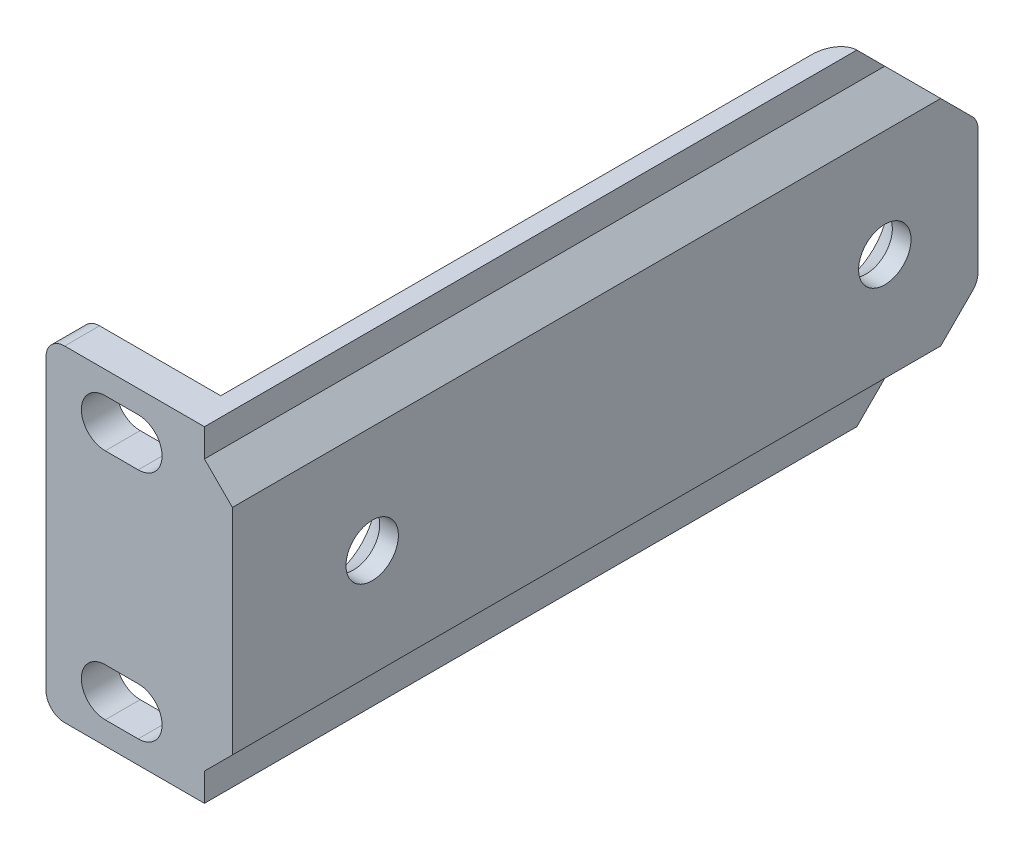
ISO-10303-21;
HEADER;
FILE_DESCRIPTION(('STEP AP214'),'2;1');
FILE_NAME('part.step','',(''),(''),'','','');
FILE_SCHEMA(('AUTOMOTIVE_DESIGN { 1 0 10303 214 1 1 1 1 }'));
ENDSEC;
DATA;
#1=APPLICATION_CONTEXT('core data for automotive mechanical design processes');
#2=APPLICATION_PROTOCOL_DEFINITION('international standard','automotive_design',2000,#1);
#3=PRODUCT_CONTEXT('',#1,'mechanical');
#4=PRODUCT('Part','Part','',(#3));
#5=PRODUCT_RELATED_PRODUCT_CATEGORY('part','',(#4));
#6=PRODUCT_DEFINITION_FORMATION('','',#4);
#7=PRODUCT_DEFINITION_CONTEXT('part definition',#1,'design');
#8=PRODUCT_DEFINITION('design','',#6,#7);
#9=PRODUCT_DEFINITION_SHAPE('','',#8);
#10=(LENGTH_UNIT() NAMED_UNIT(*) SI_UNIT(.MILLI.,.METRE.));
#11=(NAMED_UNIT(*) PLANE_ANGLE_UNIT() SI_UNIT($,.RADIAN.));
#12=(NAMED_UNIT(*) SI_UNIT($,.STERADIAN.) SOLID_ANGLE_UNIT());
#13=UNCERTAINTY_MEASURE_WITH_UNIT(LENGTH_MEASURE(1.E-05),#10,'distance_accuracy_value','');
#14=(GEOMETRIC_REPRESENTATION_CONTEXT(3) GLOBAL_UNCERTAINTY_ASSIGNED_CONTEXT((#13)) GLOBAL_UNIT_ASSIGNED_CONTEXT((#10,
#11,#12)) REPRESENTATION_CONTEXT('',''));
#15=CARTESIAN_POINT('',(0.,0.,0.));
#16=DIRECTION('',(0.,0.,1.));
#17=DIRECTION('',(1.,0.,0.));
#18=AXIS2_PLACEMENT_3D('',#15,#16,#17);
#19=CARTESIAN_POINT('',(-25.4,22.225,0.));
#20=DIRECTION('',(0.,0.,-1.));
#21=DIRECTION('',(-1.,0.,0.));
#22=AXIS2_PLACEMENT_3D('',#19,#20,#21);
#23=PLANE('',#22);
#24=DIRECTION('',(-1.,0.,0.));
#25=VECTOR('',#24,1.);
#26=CARTESIAN_POINT('',(-12.83335,-12.6238,0.));
#27=LINE('',#26,#25);
#28=CARTESIAN_POINT('',(-12.83335,-12.6238,0.));
#29=VERTEX_POINT('',#28);
#30=CARTESIAN_POINT('',(-17.32915,-12.6238,0.));
#31=VERTEX_POINT('',#30);
#32=EDGE_CURVE('E403',#29,#31,#27,.T.);
#33=ORIENTED_EDGE('',*,*,#32,.F.);
#34=CARTESIAN_POINT('',(-12.83335,-15.875,0.));
#35=DIRECTION('',(0.,0.,1.));
#36=DIRECTION('',(1.,0.,0.));
#37=AXIS2_PLACEMENT_3D('',#34,#35,#36);
#38=CIRCLE('',#37,3.25119999999999);
#39=CARTESIAN_POINT('',(-12.83335,-19.1262,0.));
#40=VERTEX_POINT('',#39);
#41=EDGE_CURVE('E377',#40,#29,#38,.T.);
#42=ORIENTED_EDGE('',*,*,#41,.F.);
#43=DIRECTION('',(1.,0.,0.));
#44=VECTOR('',#43,1.);
#45=CARTESIAN_POINT('',(-12.83335,-19.1262,0.));
#46=LINE('',#45,#44);
#47=CARTESIAN_POINT('',(-17.32915,-19.1262,0.));
#48=VERTEX_POINT('',#47);
#49=EDGE_CURVE('E393',#48,#40,#46,.T.);
#50=ORIENTED_EDGE('',*,*,#49,.F.);
#51=CARTESIAN_POINT('',(-17.32915,-15.875,0.));
#52=DIRECTION('',(0.,0.,1.));
#53=DIRECTION('',(1.,0.,0.));
#54=AXIS2_PLACEMENT_3D('',#51,#52,#53);
#55=CIRCLE('',#54,3.2512);
#56=EDGE_CURVE('E400',#31,#48,#55,.T.);
#57=ORIENTED_EDGE('',*,*,#56,.F.);
#58=EDGE_LOOP('',(#33,#42,#50,#57));
#59=FACE_BOUND('',#58,.T.);
#60=DIRECTION('',(-1.,0.,0.));
#61=VECTOR('',#60,1.);
#62=CARTESIAN_POINT('',(-12.83335,19.1262,0.));
#63=LINE('',#62,#61);
#64=CARTESIAN_POINT('',(-12.83335,19.1262,0.));
#65=VERTEX_POINT('',#64);
#66=CARTESIAN_POINT('',(-17.32915,19.1262,0.));
#67=VERTEX_POINT('',#66);
#68=EDGE_CURVE('E383',#65,#67,#63,.T.);
#69=ORIENTED_EDGE('',*,*,#68,.F.);
#70=CARTESIAN_POINT('',(-12.83335,15.875,0.));
#71=DIRECTION('',(0.,0.,1.));
#72=DIRECTION('',(-1.,0.,0.));
#73=AXIS2_PLACEMENT_3D('',#70,#71,#72);
#74=CIRCLE('',#73,3.25119999999999);
#75=CARTESIAN_POINT('',(-12.83335,12.6238,0.));
#76=VERTEX_POINT('',#75);
#77=EDGE_CURVE('E386',#76,#65,#74,.T.);
#78=ORIENTED_EDGE('',*,*,#77,.F.);
#79=DIRECTION('',(1.,0.,0.));
#80=VECTOR('',#79,1.);
#81=CARTESIAN_POINT('',(-12.83335,12.6238,0.));
#82=LINE('',#81,#80);
#83=CARTESIAN_POINT('',(-17.32915,12.6238,0.));
#84=VERTEX_POINT('',#83);
#85=EDGE_CURVE('E371',#84,#76,#82,.T.);
#86=ORIENTED_EDGE('',*,*,#85,.F.);
#87=CARTESIAN_POINT('',(-17.32915,15.875,0.));
#88=DIRECTION('',(0.,0.,1.));
#89=DIRECTION('',(-1.,0.,0.));
#90=AXIS2_PLACEMENT_3D('',#87,#88,#89);
#91=CIRCLE('',#90,3.2512);
#92=EDGE_CURVE('E380',#67,#84,#91,.T.);
#93=ORIENTED_EDGE('',*,*,#92,.F.);
#94=EDGE_LOOP('',(#69,#78,#86,#93));
#95=FACE_BOUND('',#94,.T.);
#96=DIRECTION('',(0.,-1.,0.));
#97=VECTOR('',#96,1.);
#98=CARTESIAN_POINT('',(0.,22.225,0.));
#99=LINE('',#98,#97);
#100=CARTESIAN_POINT('',(0.,14.605,0.));
#101=VERTEX_POINT('',#100);
#102=CARTESIAN_POINT('',(0.,-14.605,0.));
#103=VERTEX_POINT('',#102);
#104=EDGE_CURVE('E327',#101,#103,#99,.T.);
#105=ORIENTED_EDGE('',*,*,#104,.F.);
#106=DIRECTION('',(0.707106781186549,-0.707106781186546,0.));
#107=VECTOR('',#106,1.);
#108=CARTESIAN_POINT('',(0.,14.605,0.));
#109=LINE('',#108,#107);
#110=CARTESIAN_POINT('',(-3.81,18.415,0.));
#111=VERTEX_POINT('',#110);
#112=EDGE_CURVE('E237',#101,#111,#109,.F.);
#113=ORIENTED_EDGE('',*,*,#112,.T.);
#114=DIRECTION('',(0.,-1.,0.));
#115=VECTOR('',#114,1.);
#116=CARTESIAN_POINT('',(-3.81,22.225,0.));
#117=LINE('',#116,#115);
#118=CARTESIAN_POINT('',(-3.81,22.225,0.));
#119=VERTEX_POINT('',#118);
#120=EDGE_CURVE('E222',#119,#111,#117,.T.);
#121=ORIENTED_EDGE('',*,*,#120,.F.);
#122=DIRECTION('',(1.,0.,0.));
#123=VECTOR('',#122,1.);
#124=CARTESIAN_POINT('',(-25.4,22.225,0.));
#125=LINE('',#124,#123);
#126=CARTESIAN_POINT('',(-22.86,22.225,0.));
#127=VERTEX_POINT('',#126);
#128=EDGE_CURVE('E345',#127,#119,#125,.T.);
#129=ORIENTED_EDGE('',*,*,#128,.F.);
#130=CARTESIAN_POINT('',(-22.86,19.685,0.));
#131=DIRECTION('',(0.,0.,-1.));
#132=DIRECTION('',(-1.,0.,0.));
#133=AXIS2_PLACEMENT_3D('',#130,#131,#132);
#134=CIRCLE('',#133,2.54);
#135=CARTESIAN_POINT('',(-25.4,19.685,0.));
#136=VERTEX_POINT('',#135);
#137=EDGE_CURVE('E296',#127,#136,#134,.F.);
#138=ORIENTED_EDGE('',*,*,#137,.T.);
#139=DIRECTION('',(0.,-1.,0.));
#140=VECTOR('',#139,1.);
#141=CARTESIAN_POINT('',(-25.4,22.225,0.));
#142=LINE('',#141,#140);
#143=CARTESIAN_POINT('',(-25.4,-19.685,0.));
#144=VERTEX_POINT('',#143);
#145=EDGE_CURVE('E338',#136,#144,#142,.T.);
#146=ORIENTED_EDGE('',*,*,#145,.T.);
#147=CARTESIAN_POINT('',(-22.86,-19.685,0.));
#148=DIRECTION('',(0.,0.,-1.));
#149=DIRECTION('',(-1.,0.,0.));
#150=AXIS2_PLACEMENT_3D('',#147,#148,#149);
#151=CIRCLE('',#150,2.54);
#152=CARTESIAN_POINT('',(-22.86,-22.225,0.));
#153=VERTEX_POINT('',#152);
#154=EDGE_CURVE('E298',#144,#153,#151,.F.);
#155=ORIENTED_EDGE('',*,*,#154,.T.);
#156=DIRECTION('',(1.,0.,0.));
#157=VECTOR('',#156,1.);
#158=CARTESIAN_POINT('',(-25.4,-22.225,0.));
#159=LINE('',#158,#157);
#160=CARTESIAN_POINT('',(-3.80999999999999,-22.225,0.));
#161=VERTEX_POINT('',#160);
#162=EDGE_CURVE('E224',#153,#161,#159,.T.);
#163=ORIENTED_EDGE('',*,*,#162,.T.);
#164=DIRECTION('',(0.,-1.,0.));
#165=VECTOR('',#164,1.);
#166=CARTESIAN_POINT('',(-3.80999999999999,-22.225,0.));
#167=LINE('',#166,#165);
#168=CARTESIAN_POINT('',(-3.80999999999999,-18.415,0.));
#169=VERTEX_POINT('',#168);
#170=EDGE_CURVE('E360',#169,#161,#167,.T.);
#171=ORIENTED_EDGE('',*,*,#170,.F.);
#172=DIRECTION('',(-0.707106781186546,-0.707106781186549,0.));
#173=VECTOR('',#172,1.);
#174=CARTESIAN_POINT('',(-3.81000000000001,-18.415,0.));
#175=LINE('',#174,#173);
#176=EDGE_CURVE('E57',#169,#103,#175,.F.);
#177=ORIENTED_EDGE('',*,*,#176,.T.);
#178=EDGE_LOOP('',(#105,#113,#121,#129,#138,#146,#155,#163,#171,#177));
#179=FACE_BOUND('',#178,.T.);
#180=ADVANCED_FACE('F34',(#59,#95,#179),#23,.F.);
#181=CARTESIAN_POINT('',(0.,22.225,0.));
#182=DIRECTION('',(-1.,0.,0.));
#183=DIRECTION('',(0.,0.,1.));
#184=AXIS2_PLACEMENT_3D('',#181,#182,#183);
#185=PLANE('',#184);
#186=CARTESIAN_POINT('',(0.,0.,-19.05));
#187=DIRECTION('',(-1.,0.,0.));
#188=DIRECTION('',(0.,0.,1.));
#189=AXIS2_PLACEMENT_3D('',#186,#187,#188);
#190=CIRCLE('',#189,3.57124);
#191=CARTESIAN_POINT('',(0.,0.,-15.47876));
#192=VERTEX_POINT('',#191);
#193=EDGE_CURVE('E415',#192,#192,#190,.T.);
#194=ORIENTED_EDGE('',*,*,#193,.T.);
#195=EDGE_LOOP('',(#194));
#196=FACE_BOUND('',#195,.T.);
#197=CARTESIAN_POINT('',(0.,0.,-88.9));
#198=DIRECTION('',(-1.,0.,0.));
#199=DIRECTION('',(0.,0.,1.));
#200=AXIS2_PLACEMENT_3D('',#197,#198,#199);
#201=CIRCLE('',#200,3.57124);
#202=CARTESIAN_POINT('',(0.,0.,-85.32876));
#203=VERTEX_POINT('',#202);
#204=EDGE_CURVE('E388',#203,#203,#201,.T.);
#205=ORIENTED_EDGE('',*,*,#204,.T.);
#206=EDGE_LOOP('',(#205));
#207=FACE_BOUND('',#206,.T.);
#208=DIRECTION('',(0.,0.707106781186547,0.707106781186547));
#209=VECTOR('',#208,1.);
#210=CARTESIAN_POINT('',(0.,9.525,-101.6));
#211=LINE('',#210,#209);
#212=CARTESIAN_POINT('',(0.,10.2689487757862,-100.856051224214));
#213=VERTEX_POINT('',#212);
#214=CARTESIAN_POINT('',(0.,14.605,-96.52));
#215=VERTEX_POINT('',#214);
#216=EDGE_CURVE('E247',#213,#215,#211,.T.);
#217=ORIENTED_EDGE('',*,*,#216,.T.);
#218=DIRECTION('',(0.,0.,1.));
#219=VECTOR('',#218,1.);
#220=CARTESIAN_POINT('',(0.,14.605,0.));
#221=LINE('',#220,#219);
#222=EDGE_CURVE('E236',#215,#101,#221,.T.);
#223=ORIENTED_EDGE('',*,*,#222,.T.);
#224=ORIENTED_EDGE('',*,*,#104,.T.);
#225=DIRECTION('',(0.,0.,-1.));
#226=VECTOR('',#225,1.);
#227=CARTESIAN_POINT('',(0.,-14.605,0.));
#228=LINE('',#227,#226);
#229=CARTESIAN_POINT('',(0.,-14.605,-96.52));
#230=VERTEX_POINT('',#229);
#231=EDGE_CURVE('E49',#103,#230,#228,.T.);
#232=ORIENTED_EDGE('',*,*,#231,.T.);
#233=DIRECTION('',(0.,0.707106781186547,-0.707106781186547));
#234=VECTOR('',#233,1.);
#235=CARTESIAN_POINT('',(0.,-9.525,-101.6));
#236=LINE('',#235,#234);
#237=CARTESIAN_POINT('',(0.,-10.2689487757862,-100.856051224214));
#238=VERTEX_POINT('',#237);
#239=EDGE_CURVE('E427',#230,#238,#236,.T.);
#240=ORIENTED_EDGE('',*,*,#239,.T.);
#241=CARTESIAN_POINT('',(0.,-8.47289755157233,-99.06));
#242=DIRECTION('',(-1.,0.,0.));
#243=DIRECTION('',(0.,0.,1.));
#244=AXIS2_PLACEMENT_3D('',#241,#242,#243);
#245=CIRCLE('',#244,2.54);
#246=CARTESIAN_POINT('',(0.,-8.47289755157233,-101.6));
#247=VERTEX_POINT('',#246);
#248=EDGE_CURVE('E264',#238,#247,#245,.F.);
#249=ORIENTED_EDGE('',*,*,#248,.T.);
#250=DIRECTION('',(0.,-1.,0.));
#251=VECTOR('',#250,1.);
#252=CARTESIAN_POINT('',(0.,22.225,-101.6));
#253=LINE('',#252,#251);
#254=CARTESIAN_POINT('',(0.,8.47289755157233,-101.6));
#255=VERTEX_POINT('',#254);
#256=EDGE_CURVE('E329',#255,#247,#253,.T.);
#257=ORIENTED_EDGE('',*,*,#256,.F.);
#258=CARTESIAN_POINT('',(0.,8.47289755157233,-99.06));
#259=DIRECTION('',(-1.,0.,0.));
#260=DIRECTION('',(0.,0.,1.));
#261=AXIS2_PLACEMENT_3D('',#258,#259,#260);
#262=CIRCLE('',#261,2.54);
#263=EDGE_CURVE('E243',#255,#213,#262,.F.);
#264=ORIENTED_EDGE('',*,*,#263,.T.);
#265=EDGE_LOOP('',(#217,#223,#224,#232,#240,#249,#257,#264));
#266=FACE_BOUND('',#265,.T.);
#267=ADVANCED_FACE('F429',(#196,#207,#266),#185,.F.);
#268=CARTESIAN_POINT('',(0.,22.225,-101.6));
#269=DIRECTION('',(0.,0.,1.));
#270=DIRECTION('',(1.,0.,0.));
#271=AXIS2_PLACEMENT_3D('',#268,#269,#270);
#272=PLANE('',#271);
#273=DIRECTION('',(0.,-1.,0.));
#274=VECTOR('',#273,1.);
#275=CARTESIAN_POINT('',(-3.81,22.225,-101.6));
#276=LINE('',#275,#274);
#277=CARTESIAN_POINT('',(-3.81,-8.47289755157233,-101.6));
#278=VERTEX_POINT('',#277);
#279=CARTESIAN_POINT('',(-3.81,8.47289755157233,-101.6));
#280=VERTEX_POINT('',#279);
#281=EDGE_CURVE('E270',#278,#280,#276,.F.);
#282=ORIENTED_EDGE('',*,*,#281,.T.);
#283=DIRECTION('',(-1.,0.,0.));
#284=VECTOR('',#283,1.);
#285=CARTESIAN_POINT('',(0.,8.47289755157233,-101.6));
#286=LINE('',#285,#284);
#287=EDGE_CURVE('E268',#280,#255,#286,.F.);
#288=ORIENTED_EDGE('',*,*,#287,.T.);
#289=ORIENTED_EDGE('',*,*,#256,.T.);
#290=DIRECTION('',(-1.,0.,0.));
#291=VECTOR('',#290,1.);
#292=CARTESIAN_POINT('',(0.,-8.47289755157233,-101.6));
#293=LINE('',#292,#291);
#294=EDGE_CURVE('E272',#247,#278,#293,.T.);
#295=ORIENTED_EDGE('',*,*,#294,.T.);
#296=EDGE_LOOP('',(#282,#288,#289,#295));
#297=FACE_BOUND('',#296,.T.);
#298=ADVANCED_FACE('F443',(#297),#272,.F.);
#299=CARTESIAN_POINT('',(-6.35,22.225,-101.6));
#300=DIRECTION('',(1.,0.,0.));
#301=DIRECTION('',(0.,0.,-1.));
#302=AXIS2_PLACEMENT_3D('',#299,#300,#301);
#303=PLANE('',#302);
#304=CARTESIAN_POINT('',(-6.34999999999999,0.,-19.05));
#305=DIRECTION('',(-1.,0.,0.));
#306=DIRECTION('',(0.,0.,1.));
#307=AXIS2_PLACEMENT_3D('',#304,#305,#306);
#308=CIRCLE('',#307,6.8804917);
#309=CARTESIAN_POINT('',(-6.34999999999999,0.,-12.1695083));
#310=VERTEX_POINT('',#309);
#311=EDGE_CURVE('E421',#310,#310,#308,.T.);
#312=ORIENTED_EDGE('',*,*,#311,.F.);
#313=EDGE_LOOP('',(#312));
#314=FACE_BOUND('',#313,.T.);
#315=CARTESIAN_POINT('',(-6.34999999999999,0.,-88.9));
#316=DIRECTION('',(-1.,0.,0.));
#317=DIRECTION('',(0.,0.,1.));
#318=AXIS2_PLACEMENT_3D('',#315,#316,#317);
#319=CIRCLE('',#318,6.8804917);
#320=CARTESIAN_POINT('',(-6.34999999999999,0.,-82.0195083));
#321=VERTEX_POINT('',#320);
#322=EDGE_CURVE('E412',#321,#321,#319,.T.);
#323=ORIENTED_EDGE('',*,*,#322,.F.);
#324=EDGE_LOOP('',(#323));
#325=FACE_BOUND('',#324,.T.);
#326=DIRECTION('',(0.,-1.,0.));
#327=VECTOR('',#326,1.);
#328=CARTESIAN_POINT('',(-6.35,22.225,-99.06));
#329=LINE('',#328,#327);
#330=CARTESIAN_POINT('',(-6.35,8.47289755157233,-99.06));
#331=VERTEX_POINT('',#330);
#332=CARTESIAN_POINT('',(-6.35,-8.47289755157233,-99.06));
#333=VERTEX_POINT('',#332);
#334=EDGE_CURVE('E278',#331,#333,#329,.T.);
#335=ORIENTED_EDGE('',*,*,#334,.T.);
#336=DIRECTION('',(0.,0.707106781186548,-0.707106781186548));
#337=VECTOR('',#336,1.);
#338=CARTESIAN_POINT('',(-6.35,8.14605122421383,-115.678948775786));
#339=LINE('',#338,#337);
#340=CARTESIAN_POINT('',(-6.35,-22.225,-85.3078975515723));
#341=VERTEX_POINT('',#340);
#342=EDGE_CURVE('E276',#333,#341,#339,.F.);
#343=ORIENTED_EDGE('',*,*,#342,.T.);
#344=DIRECTION('',(0.,0.,1.));
#345=VECTOR('',#344,1.);
#346=CARTESIAN_POINT('',(-6.35,-22.225,-101.6));
#347=LINE('',#346,#345);
#348=CARTESIAN_POINT('',(-6.34999999999999,-22.225,-4.7625));
#349=VERTEX_POINT('',#348);
#350=EDGE_CURVE('E346',#341,#349,#347,.T.);
#351=ORIENTED_EDGE('',*,*,#350,.T.);
#352=DIRECTION('',(0.,-1.,0.));
#353=VECTOR('',#352,1.);
#354=CARTESIAN_POINT('',(-6.34999999999999,22.225,-4.7625));
#355=LINE('',#354,#353);
#356=CARTESIAN_POINT('',(-6.34999999999999,22.225,-4.7625));
#357=VERTEX_POINT('',#356);
#358=EDGE_CURVE('E332',#357,#349,#355,.T.);
#359=ORIENTED_EDGE('',*,*,#358,.F.);
#360=DIRECTION('',(0.,0.,1.));
#361=VECTOR('',#360,1.);
#362=CARTESIAN_POINT('',(-6.35,22.225,-101.6));
#363=LINE('',#362,#361);
#364=CARTESIAN_POINT('',(-6.35,22.225,-85.3078975515723));
#365=VERTEX_POINT('',#364);
#366=EDGE_CURVE('E352',#365,#357,#363,.T.);
#367=ORIENTED_EDGE('',*,*,#366,.F.);
#368=DIRECTION('',(0.,0.707106781186548,0.707106781186548));
#369=VECTOR('',#368,1.);
#370=CARTESIAN_POINT('',(-6.35,14.0789487757862,-93.4539487757862));
#371=LINE('',#370,#369);
#372=EDGE_CURVE('E280',#365,#331,#371,.F.);
#373=ORIENTED_EDGE('',*,*,#372,.T.);
#374=EDGE_LOOP('',(#335,#343,#351,#359,#367,#373));
#375=FACE_BOUND('',#374,.T.);
#376=ADVANCED_FACE('F577',(#314,#325,#375),#303,.F.);
#377=CARTESIAN_POINT('',(-6.34999999999999,22.225,-4.7625));
#378=DIRECTION('',(0.,0.,1.));
#379=DIRECTION('',(1.,0.,0.));
#380=AXIS2_PLACEMENT_3D('',#377,#378,#379);
#381=PLANE('',#380);
#382=DIRECTION('',(1.,0.,0.));
#383=VECTOR('',#382,1.);
#384=CARTESIAN_POINT('',(-6.34999999999999,-19.1262,-4.7625));
#385=LINE('',#384,#383);
#386=CARTESIAN_POINT('',(-17.32915,-19.1262,-4.7625));
#387=VERTEX_POINT('',#386);
#388=CARTESIAN_POINT('',(-12.83335,-19.1262,-4.7625));
#389=VERTEX_POINT('',#388);
#390=EDGE_CURVE('E306',#387,#389,#385,.T.);
#391=ORIENTED_EDGE('',*,*,#390,.T.);
#392=CARTESIAN_POINT('',(-12.83335,-15.875,-4.7625));
#393=DIRECTION('',(0.,0.,1.));
#394=DIRECTION('',(1.,0.,0.));
#395=AXIS2_PLACEMENT_3D('',#392,#393,#394);
#396=CIRCLE('',#395,3.25119999999999);
#397=CARTESIAN_POINT('',(-12.83335,-12.6238,-4.7625));
#398=VERTEX_POINT('',#397);
#399=EDGE_CURVE('E303',#389,#398,#396,.T.);
#400=ORIENTED_EDGE('',*,*,#399,.T.);
#401=DIRECTION('',(-1.,0.,0.));
#402=VECTOR('',#401,1.);
#403=CARTESIAN_POINT('',(-6.35,-12.6238,-4.7625));
#404=LINE('',#403,#402);
#405=CARTESIAN_POINT('',(-17.32915,-12.6238,-4.7625));
#406=VERTEX_POINT('',#405);
#407=EDGE_CURVE('E312',#398,#406,#404,.T.);
#408=ORIENTED_EDGE('',*,*,#407,.T.);
#409=CARTESIAN_POINT('',(-17.32915,-15.875,-4.7625));
#410=DIRECTION('',(0.,0.,1.));
#411=DIRECTION('',(1.,0.,0.));
#412=AXIS2_PLACEMENT_3D('',#409,#410,#411);
#413=CIRCLE('',#412,3.2512);
#414=EDGE_CURVE('E309',#406,#387,#413,.T.);
#415=ORIENTED_EDGE('',*,*,#414,.T.);
#416=EDGE_LOOP('',(#391,#400,#408,#415));
#417=FACE_BOUND('',#416,.T.);
#418=DIRECTION('',(1.,0.,0.));
#419=VECTOR('',#418,1.);
#420=CARTESIAN_POINT('',(-6.34999999999999,12.6238,-4.7625));
#421=LINE('',#420,#419);
#422=CARTESIAN_POINT('',(-17.32915,12.6238,-4.7625));
#423=VERTEX_POINT('',#422);
#424=CARTESIAN_POINT('',(-12.83335,12.6238,-4.7625));
#425=VERTEX_POINT('',#424);
#426=EDGE_CURVE('E318',#423,#425,#421,.T.);
#427=ORIENTED_EDGE('',*,*,#426,.T.);
#428=CARTESIAN_POINT('',(-12.83335,15.875,-4.7625));
#429=DIRECTION('',(0.,0.,1.));
#430=DIRECTION('',(1.,0.,0.));
#431=AXIS2_PLACEMENT_3D('',#428,#429,#430);
#432=CIRCLE('',#431,3.25119999999999);
#433=CARTESIAN_POINT('',(-12.83335,19.1262,-4.7625));
#434=VERTEX_POINT('',#433);
#435=EDGE_CURVE('E315',#425,#434,#432,.T.);
#436=ORIENTED_EDGE('',*,*,#435,.T.);
#437=DIRECTION('',(-1.,0.,0.));
#438=VECTOR('',#437,1.);
#439=CARTESIAN_POINT('',(-6.34999999999999,19.1262,-4.7625));
#440=LINE('',#439,#438);
#441=CARTESIAN_POINT('',(-17.32915,19.1262,-4.7625));
#442=VERTEX_POINT('',#441);
#443=EDGE_CURVE('E324',#434,#442,#440,.T.);
#444=ORIENTED_EDGE('',*,*,#443,.T.);
#445=CARTESIAN_POINT('',(-17.32915,15.875,-4.7625));
#446=DIRECTION('',(0.,0.,1.));
#447=DIRECTION('',(1.,0.,0.));
#448=AXIS2_PLACEMENT_3D('',#445,#446,#447);
#449=CIRCLE('',#448,3.2512);
#450=EDGE_CURVE('E321',#442,#423,#449,.T.);
#451=ORIENTED_EDGE('',*,*,#450,.T.);
#452=EDGE_LOOP('',(#427,#436,#444,#451));
#453=FACE_BOUND('',#452,.T.);
#454=DIRECTION('',(0.,-1.,0.));
#455=VECTOR('',#454,1.);
#456=CARTESIAN_POINT('',(-25.4,22.225,-4.7625));
#457=LINE('',#456,#455);
#458=CARTESIAN_POINT('',(-25.4,19.685,-4.7625));
#459=VERTEX_POINT('',#458);
#460=CARTESIAN_POINT('',(-25.4,-19.685,-4.7625));
#461=VERTEX_POINT('',#460);
#462=EDGE_CURVE('E335',#459,#461,#457,.T.);
#463=ORIENTED_EDGE('',*,*,#462,.F.);
#464=CARTESIAN_POINT('',(-22.86,19.685,-4.7625));
#465=DIRECTION('',(0.,0.,1.));
#466=DIRECTION('',(1.,0.,0.));
#467=AXIS2_PLACEMENT_3D('',#464,#465,#466);
#468=CIRCLE('',#467,2.54);
#469=CARTESIAN_POINT('',(-22.86,22.225,-4.7625));
#470=VERTEX_POINT('',#469);
#471=EDGE_CURVE('E287',#459,#470,#468,.F.);
#472=ORIENTED_EDGE('',*,*,#471,.T.);
#473=DIRECTION('',(-1.,0.,0.));
#474=VECTOR('',#473,1.);
#475=CARTESIAN_POINT('',(-6.34999999999999,22.225,-4.7625));
#476=LINE('',#475,#474);
#477=EDGE_CURVE('E341',#357,#470,#476,.T.);
#478=ORIENTED_EDGE('',*,*,#477,.F.);
#479=ORIENTED_EDGE('',*,*,#358,.T.);
#480=DIRECTION('',(-1.,0.,0.));
#481=VECTOR('',#480,1.);
#482=CARTESIAN_POINT('',(-6.34999999999999,-22.225,-4.7625));
#483=LINE('',#482,#481);
#484=CARTESIAN_POINT('',(-22.86,-22.225,-4.7625));
#485=VERTEX_POINT('',#484);
#486=EDGE_CURVE('E342',#349,#485,#483,.T.);
#487=ORIENTED_EDGE('',*,*,#486,.T.);
#488=CARTESIAN_POINT('',(-22.86,-19.685,-4.7625));
#489=DIRECTION('',(0.,0.,1.));
#490=DIRECTION('',(1.,0.,0.));
#491=AXIS2_PLACEMENT_3D('',#488,#489,#490);
#492=CIRCLE('',#491,2.54);
#493=EDGE_CURVE('E289',#485,#461,#492,.F.);
#494=ORIENTED_EDGE('',*,*,#493,.T.);
#495=EDGE_LOOP('',(#463,#472,#478,#479,#487,#494));
#496=FACE_BOUND('',#495,.T.);
#497=ADVANCED_FACE('F471',(#417,#453,#496),#381,.F.);
#498=CARTESIAN_POINT('',(-25.4,22.225,-4.7625));
#499=DIRECTION('',(1.,0.,0.));
#500=DIRECTION('',(0.,0.,-1.));
#501=AXIS2_PLACEMENT_3D('',#498,#499,#500);
#502=PLANE('',#501);
#503=ORIENTED_EDGE('',*,*,#145,.F.);
#504=DIRECTION('',(0.,0.,1.));
#505=VECTOR('',#504,1.);
#506=CARTESIAN_POINT('',(-25.4,19.685,-4.7625));
#507=LINE('',#506,#505);
#508=EDGE_CURVE('E291',#136,#459,#507,.F.);
#509=ORIENTED_EDGE('',*,*,#508,.T.);
#510=ORIENTED_EDGE('',*,*,#462,.T.);
#511=DIRECTION('',(0.,0.,1.));
#512=VECTOR('',#511,1.);
#513=CARTESIAN_POINT('',(-25.4,-19.685,-4.7625));
#514=LINE('',#513,#512);
#515=EDGE_CURVE('E293',#461,#144,#514,.T.);
#516=ORIENTED_EDGE('',*,*,#515,.T.);
#517=EDGE_LOOP('',(#503,#509,#510,#516));
#518=FACE_BOUND('',#517,.T.);
#519=ADVANCED_FACE('F468',(#518),#502,.F.);
#520=CARTESIAN_POINT('',(0.,22.225,0.));
#521=DIRECTION('',(0.,1.,0.));
#522=DIRECTION('',(0.,0.,1.));
#523=AXIS2_PLACEMENT_3D('',#520,#521,#522);
#524=PLANE('',#523);
#525=DIRECTION('',(0.,0.,1.));
#526=VECTOR('',#525,1.);
#527=CARTESIAN_POINT('',(-3.81,22.225,-101.6));
#528=LINE('',#527,#526);
#529=CARTESIAN_POINT('',(-3.81,22.225,-88.9));
#530=VERTEX_POINT('',#529);
#531=EDGE_CURVE('E225',#530,#119,#528,.T.);
#532=ORIENTED_EDGE('',*,*,#531,.F.);
#533=CARTESIAN_POINT('',(-3.81,22.225,-85.3078975515723));
#534=DIRECTION('',(0.,1.,0.));
#535=DIRECTION('',(0.,0.,1.));
#536=AXIS2_PLACEMENT_3D('',#533,#534,#535);
#537=ELLIPSE('',#536,3.59210244842766,2.54);
#538=EDGE_CURVE('E212',#530,#365,#537,.T.);
#539=ORIENTED_EDGE('',*,*,#538,.T.);
#540=ORIENTED_EDGE('',*,*,#366,.T.);
#541=ORIENTED_EDGE('',*,*,#477,.T.);
#542=DIRECTION('',(0.,0.,1.));
#543=VECTOR('',#542,1.);
#544=CARTESIAN_POINT('',(-22.86,22.225,0.));
#545=LINE('',#544,#543);
#546=EDGE_CURVE('E300',#470,#127,#545,.T.);
#547=ORIENTED_EDGE('',*,*,#546,.T.);
#548=ORIENTED_EDGE('',*,*,#128,.T.);
#549=EDGE_LOOP('',(#532,#539,#540,#541,#547,#548));
#550=FACE_BOUND('',#549,.T.);
#551=ADVANCED_FACE('F459',(#550),#524,.T.);
#552=CARTESIAN_POINT('',(0.,-22.225,0.));
#553=DIRECTION('',(0.,1.,0.));
#554=DIRECTION('',(0.,0.,1.));
#555=AXIS2_PLACEMENT_3D('',#552,#553,#554);
#556=PLANE('',#555);
#557=ORIENTED_EDGE('',*,*,#350,.F.);
#558=CARTESIAN_POINT('',(-3.81,-22.225,-85.3078975515723));
#559=DIRECTION('',(0.,1.,0.));
#560=DIRECTION('',(0.,0.,-1.));
#561=AXIS2_PLACEMENT_3D('',#558,#559,#560);
#562=ELLIPSE('',#561,3.59210244842766,2.54);
#563=CARTESIAN_POINT('',(-3.80999999999999,-22.225,-88.9));
#564=VERTEX_POINT('',#563);
#565=EDGE_CURVE('E274',#341,#564,#562,.F.);
#566=ORIENTED_EDGE('',*,*,#565,.T.);
#567=DIRECTION('',(0.,0.,1.));
#568=VECTOR('',#567,1.);
#569=CARTESIAN_POINT('',(-3.80999999999999,-22.225,-101.6));
#570=LINE('',#569,#568);
#571=EDGE_CURVE('E359',#564,#161,#570,.T.);
#572=ORIENTED_EDGE('',*,*,#571,.T.);
#573=ORIENTED_EDGE('',*,*,#162,.F.);
#574=DIRECTION('',(0.,0.,1.));
#575=VECTOR('',#574,1.);
#576=CARTESIAN_POINT('',(-22.86,-22.225,0.));
#577=LINE('',#576,#575);
#578=EDGE_CURVE('E231',#153,#485,#577,.F.);
#579=ORIENTED_EDGE('',*,*,#578,.T.);
#580=ORIENTED_EDGE('',*,*,#486,.F.);
#581=EDGE_LOOP('',(#557,#566,#572,#573,#579,#580));
#582=FACE_BOUND('',#581,.T.);
#583=ADVANCED_FACE('F480',(#582),#556,.F.);
#584=CARTESIAN_POINT('',(-3.80999999999999,-22.225,-101.6));
#585=DIRECTION('',(-1.,0.,0.));
#586=DIRECTION('',(0.,0.,1.));
#587=AXIS2_PLACEMENT_3D('',#584,#585,#586);
#588=PLANE('',#587);
#589=ORIENTED_EDGE('',*,*,#571,.F.);
#590=DIRECTION('',(0.,0.707106781186548,-0.707106781186548));
#591=VECTOR('',#590,1.);
#592=CARTESIAN_POINT('',(-3.80999999999999,-15.875,-95.25));
#593=LINE('',#592,#591);
#594=CARTESIAN_POINT('',(-3.80999999999999,-18.415,-92.71));
#595=VERTEX_POINT('',#594);
#596=EDGE_CURVE('E424',#564,#595,#593,.T.);
#597=ORIENTED_EDGE('',*,*,#596,.T.);
#598=DIRECTION('',(0.,0.,1.));
#599=VECTOR('',#598,1.);
#600=CARTESIAN_POINT('',(-3.80999999999999,-18.415,-101.6));
#601=LINE('',#600,#599);
#602=EDGE_CURVE('E356',#595,#169,#601,.T.);
#603=ORIENTED_EDGE('',*,*,#602,.T.);
#604=ORIENTED_EDGE('',*,*,#170,.T.);
#605=EDGE_LOOP('',(#589,#597,#603,#604));
#606=FACE_BOUND('',#605,.T.);
#607=ADVANCED_FACE('F485',(#606),#588,.F.);
#608=CARTESIAN_POINT('',(-3.81,22.225,-101.6));
#609=DIRECTION('',(-1.,0.,0.));
#610=DIRECTION('',(0.,-1.,0.));
#611=AXIS2_PLACEMENT_3D('',#608,#609,#610);
#612=PLANE('',#611);
#613=DIRECTION('',(0.,0.,1.));
#614=VECTOR('',#613,1.);
#615=CARTESIAN_POINT('',(-3.81,18.415,-101.6));
#616=LINE('',#615,#614);
#617=CARTESIAN_POINT('',(-3.81,18.415,-92.71));
#618=VERTEX_POINT('',#617);
#619=EDGE_CURVE('E217',#618,#111,#616,.T.);
#620=ORIENTED_EDGE('',*,*,#619,.F.);
#621=DIRECTION('',(0.,0.707106781186548,0.707106781186548));
#622=VECTOR('',#621,1.);
#623=CARTESIAN_POINT('',(-3.81,15.875,-95.25));
#624=LINE('',#623,#622);
#625=EDGE_CURVE('E219',#618,#530,#624,.T.);
#626=ORIENTED_EDGE('',*,*,#625,.T.);
#627=ORIENTED_EDGE('',*,*,#531,.T.);
#628=ORIENTED_EDGE('',*,*,#120,.T.);
#629=EDGE_LOOP('',(#620,#626,#627,#628));
#630=FACE_BOUND('',#629,.T.);
#631=ADVANCED_FACE('F218',(#630),#612,.F.);
#632=CARTESIAN_POINT('',(-12.83335,15.875,-101.6));
#633=DIRECTION('',(0.,0.,1.));
#634=DIRECTION('',(1.,0.,0.));
#635=AXIS2_PLACEMENT_3D('',#632,#633,#634);
#636=CYLINDRICAL_SURFACE('',#635,3.25119999999999);
#637=DIRECTION('',(0.,0.,1.));
#638=VECTOR('',#637,1.);
#639=CARTESIAN_POINT('',(-12.83335,12.6238,-101.6));
#640=LINE('',#639,#638);
#641=EDGE_CURVE('E375',#425,#76,#640,.T.);
#642=ORIENTED_EDGE('',*,*,#641,.T.);
#643=ORIENTED_EDGE('',*,*,#77,.T.);
#644=DIRECTION('',(0.,0.,1.));
#645=VECTOR('',#644,1.);
#646=CARTESIAN_POINT('',(-12.83335,19.1262,-101.6));
#647=LINE('',#646,#645);
#648=EDGE_CURVE('E367',#434,#65,#647,.T.);
#649=ORIENTED_EDGE('',*,*,#648,.F.);
#650=ORIENTED_EDGE('',*,*,#435,.F.);
#651=EDGE_LOOP('',(#642,#643,#649,#650));
#652=FACE_BOUND('',#651,.T.);
#653=ADVANCED_FACE('F554',(#652),#636,.F.);
#654=CARTESIAN_POINT('',(-12.83335,12.6238,-101.6));
#655=DIRECTION('',(0.,-1.,0.));
#656=DIRECTION('',(1.,0.,0.));
#657=AXIS2_PLACEMENT_3D('',#654,#655,#656);
#658=PLANE('',#657);
#659=DIRECTION('',(0.,0.,1.));
#660=VECTOR('',#659,1.);
#661=CARTESIAN_POINT('',(-17.32915,12.6238,-101.6));
#662=LINE('',#661,#660);
#663=EDGE_CURVE('E373',#423,#84,#662,.T.);
#664=ORIENTED_EDGE('',*,*,#663,.T.);
#665=ORIENTED_EDGE('',*,*,#85,.T.);
#666=ORIENTED_EDGE('',*,*,#641,.F.);
#667=ORIENTED_EDGE('',*,*,#426,.F.);
#668=EDGE_LOOP('',(#664,#665,#666,#667));
#669=FACE_BOUND('',#668,.T.);
#670=ADVANCED_FACE('F550',(#669),#658,.F.);
#671=CARTESIAN_POINT('',(-17.32915,15.875,-101.6));
#672=DIRECTION('',(0.,0.,1.));
#673=DIRECTION('',(1.,0.,0.));
#674=AXIS2_PLACEMENT_3D('',#671,#672,#673);
#675=CYLINDRICAL_SURFACE('',#674,3.2512);
#676=DIRECTION('',(0.,0.,1.));
#677=VECTOR('',#676,1.);
#678=CARTESIAN_POINT('',(-17.32915,19.1262,-101.6));
#679=LINE('',#678,#677);
#680=EDGE_CURVE('E370',#442,#67,#679,.T.);
#681=ORIENTED_EDGE('',*,*,#680,.T.);
#682=ORIENTED_EDGE('',*,*,#92,.T.);
#683=ORIENTED_EDGE('',*,*,#663,.F.);
#684=ORIENTED_EDGE('',*,*,#450,.F.);
#685=EDGE_LOOP('',(#681,#682,#683,#684));
#686=FACE_BOUND('',#685,.T.);
#687=ADVANCED_FACE('F553',(#686),#675,.F.);
#688=CARTESIAN_POINT('',(-12.83335,19.1262,-101.6));
#689=DIRECTION('',(0.,1.,0.));
#690=DIRECTION('',(0.,0.,1.));
#691=AXIS2_PLACEMENT_3D('',#688,#689,#690);
#692=PLANE('',#691);
#693=ORIENTED_EDGE('',*,*,#648,.T.);
#694=ORIENTED_EDGE('',*,*,#68,.T.);
#695=ORIENTED_EDGE('',*,*,#680,.F.);
#696=ORIENTED_EDGE('',*,*,#443,.F.);
#697=EDGE_LOOP('',(#693,#694,#695,#696));
#698=FACE_BOUND('',#697,.T.);
#699=ADVANCED_FACE('F548',(#698),#692,.F.);
#700=CARTESIAN_POINT('',(-12.83335,-15.875,-101.6));
#701=DIRECTION('',(0.,0.,1.));
#702=DIRECTION('',(1.,0.,0.));
#703=AXIS2_PLACEMENT_3D('',#700,#701,#702);
#704=CYLINDRICAL_SURFACE('',#703,3.25119999999999);
#705=DIRECTION('',(0.,0.,1.));
#706=VECTOR('',#705,1.);
#707=CARTESIAN_POINT('',(-12.83335,-19.1262,-101.6));
#708=LINE('',#707,#706);
#709=EDGE_CURVE('E364',#389,#40,#708,.T.);
#710=ORIENTED_EDGE('',*,*,#709,.T.);
#711=ORIENTED_EDGE('',*,*,#41,.T.);
#712=DIRECTION('',(0.,0.,1.));
#713=VECTOR('',#712,1.);
#714=CARTESIAN_POINT('',(-12.83335,-12.6238,-101.6));
#715=LINE('',#714,#713);
#716=EDGE_CURVE('E389',#398,#29,#715,.T.);
#717=ORIENTED_EDGE('',*,*,#716,.F.);
#718=ORIENTED_EDGE('',*,*,#399,.F.);
#719=EDGE_LOOP('',(#710,#711,#717,#718));
#720=FACE_BOUND('',#719,.T.);
#721=ADVANCED_FACE('F538',(#720),#704,.F.);
#722=CARTESIAN_POINT('',(-12.83335,-19.1262,-101.6));
#723=DIRECTION('',(0.,-1.,0.));
#724=DIRECTION('',(0.,0.,-1.));
#725=AXIS2_PLACEMENT_3D('',#722,#723,#724);
#726=PLANE('',#725);
#727=DIRECTION('',(0.,0.,1.));
#728=VECTOR('',#727,1.);
#729=CARTESIAN_POINT('',(-17.32915,-19.1262,-101.6));
#730=LINE('',#729,#728);
#731=EDGE_CURVE('E395',#387,#48,#730,.T.);
#732=ORIENTED_EDGE('',*,*,#731,.T.);
#733=ORIENTED_EDGE('',*,*,#49,.T.);
#734=ORIENTED_EDGE('',*,*,#709,.F.);
#735=ORIENTED_EDGE('',*,*,#390,.F.);
#736=EDGE_LOOP('',(#732,#733,#734,#735));
#737=FACE_BOUND('',#736,.T.);
#738=ADVANCED_FACE('F534',(#737),#726,.F.);
#739=CARTESIAN_POINT('',(-17.32915,-15.875,-101.6));
#740=DIRECTION('',(0.,0.,1.));
#741=DIRECTION('',(1.,0.,0.));
#742=AXIS2_PLACEMENT_3D('',#739,#740,#741);
#743=CYLINDRICAL_SURFACE('',#742,3.2512);
#744=DIRECTION('',(0.,0.,1.));
#745=VECTOR('',#744,1.);
#746=CARTESIAN_POINT('',(-17.32915,-12.6238,-101.6));
#747=LINE('',#746,#745);
#748=EDGE_CURVE('E392',#406,#31,#747,.T.);
#749=ORIENTED_EDGE('',*,*,#748,.T.);
#750=ORIENTED_EDGE('',*,*,#56,.T.);
#751=ORIENTED_EDGE('',*,*,#731,.F.);
#752=ORIENTED_EDGE('',*,*,#414,.F.);
#753=EDGE_LOOP('',(#749,#750,#751,#752));
#754=FACE_BOUND('',#753,.T.);
#755=ADVANCED_FACE('F537',(#754),#743,.F.);
#756=CARTESIAN_POINT('',(-12.83335,-12.6238,-101.6));
#757=DIRECTION('',(0.,1.,0.));
#758=DIRECTION('',(-1.,0.,0.));
#759=AXIS2_PLACEMENT_3D('',#756,#757,#758);
#760=PLANE('',#759);
#761=ORIENTED_EDGE('',*,*,#716,.T.);
#762=ORIENTED_EDGE('',*,*,#32,.T.);
#763=ORIENTED_EDGE('',*,*,#748,.F.);
#764=ORIENTED_EDGE('',*,*,#407,.F.);
#765=EDGE_LOOP('',(#761,#762,#763,#764));
#766=FACE_BOUND('',#765,.T.);
#767=ADVANCED_FACE('F515',(#766),#760,.F.);
#768=CARTESIAN_POINT('',(-22.86,19.685,0.));
#769=DIRECTION('',(0.,0.,-1.));
#770=DIRECTION('',(-1.,0.,0.));
#771=AXIS2_PLACEMENT_3D('',#768,#769,#770);
#772=CYLINDRICAL_SURFACE('',#771,2.54);
#773=ORIENTED_EDGE('',*,*,#471,.F.);
#774=ORIENTED_EDGE('',*,*,#508,.F.);
#775=ORIENTED_EDGE('',*,*,#137,.F.);
#776=ORIENTED_EDGE('',*,*,#546,.F.);
#777=EDGE_LOOP('',(#773,#774,#775,#776));
#778=FACE_BOUND('',#777,.T.);
#779=ADVANCED_FACE('F464',(#778),#772,.T.);
#780=CARTESIAN_POINT('',(-22.86,-19.685,-4.7625));
#781=DIRECTION('',(0.,0.,1.));
#782=DIRECTION('',(1.,0.,0.));
#783=AXIS2_PLACEMENT_3D('',#780,#781,#782);
#784=CYLINDRICAL_SURFACE('',#783,2.54);
#785=ORIENTED_EDGE('',*,*,#493,.F.);
#786=ORIENTED_EDGE('',*,*,#578,.F.);
#787=ORIENTED_EDGE('',*,*,#154,.F.);
#788=ORIENTED_EDGE('',*,*,#515,.F.);
#789=EDGE_LOOP('',(#785,#786,#787,#788));
#790=FACE_BOUND('',#789,.T.);
#791=ADVANCED_FACE('F476',(#790),#784,.T.);
#792=CARTESIAN_POINT('',(-6.34999999999999,0.,-88.9));
#793=DIRECTION('',(-1.,0.,0.));
#794=DIRECTION('',(0.,0.,1.));
#795=AXIS2_PLACEMENT_3D('',#792,#793,#794);
#796=CYLINDRICAL_SURFACE('',#795,3.57123999999999);
#797=ORIENTED_EDGE('',*,*,#204,.F.);
#798=EDGE_LOOP('',(#797));
#799=FACE_BOUND('',#798,.T.);
#800=CARTESIAN_POINT('',(-2.54314139277757,0.,-88.9));
#801=DIRECTION('',(-1.,0.,0.));
#802=DIRECTION('',(0.,0.,1.));
#803=AXIS2_PLACEMENT_3D('',#800,#801,#802);
#804=CIRCLE('',#803,3.57123999999999);
#805=CARTESIAN_POINT('',(-2.54314139277757,0.,-85.32876));
#806=VERTEX_POINT('',#805);
#807=EDGE_CURVE('E409',#806,#806,#804,.T.);
#808=ORIENTED_EDGE('',*,*,#807,.T.);
#809=EDGE_LOOP('',(#808));
#810=FACE_BOUND('',#809,.T.);
#811=ADVANCED_FACE('F517',(#799,#810),#796,.F.);
#812=CARTESIAN_POINT('',(-6.34999999999999,0.,-88.9));
#813=DIRECTION('',(-1.,0.,0.));
#814=DIRECTION('',(0.,0.,1.));
#815=AXIS2_PLACEMENT_3D('',#812,#813,#814);
#816=CONICAL_SURFACE('',#815,6.8804917,0.715584993317676);
#817=ORIENTED_EDGE('',*,*,#807,.F.);
#818=EDGE_LOOP('',(#817));
#819=FACE_BOUND('',#818,.T.);
#820=ORIENTED_EDGE('',*,*,#322,.T.);
#821=EDGE_LOOP('',(#820));
#822=FACE_BOUND('',#821,.T.);
#823=ADVANCED_FACE('F521',(#819,#822),#816,.F.);
#824=CARTESIAN_POINT('',(-6.34999999999999,0.,-19.05));
#825=DIRECTION('',(-1.,0.,0.));
#826=DIRECTION('',(0.,0.,1.));
#827=AXIS2_PLACEMENT_3D('',#824,#825,#826);
#828=CYLINDRICAL_SURFACE('',#827,3.57123999999999);
#829=ORIENTED_EDGE('',*,*,#193,.F.);
#830=EDGE_LOOP('',(#829));
#831=FACE_BOUND('',#830,.T.);
#832=CARTESIAN_POINT('',(-2.54314139277757,0.,-19.05));
#833=DIRECTION('',(-1.,0.,0.));
#834=DIRECTION('',(0.,0.,1.));
#835=AXIS2_PLACEMENT_3D('',#832,#833,#834);
#836=CIRCLE('',#835,3.57123999999999);
#837=CARTESIAN_POINT('',(-2.54314139277757,0.,-15.47876));
#838=VERTEX_POINT('',#837);
#839=EDGE_CURVE('E418',#838,#838,#836,.T.);
#840=ORIENTED_EDGE('',*,*,#839,.T.);
#841=EDGE_LOOP('',(#840));
#842=FACE_BOUND('',#841,.T.);
#843=ADVANCED_FACE('F527',(#831,#842),#828,.F.);
#844=CARTESIAN_POINT('',(-6.34999999999999,0.,-19.05));
#845=DIRECTION('',(-1.,0.,0.));
#846=DIRECTION('',(0.,0.,1.));
#847=AXIS2_PLACEMENT_3D('',#844,#845,#846);
#848=CONICAL_SURFACE('',#847,6.8804917,0.715584993317676);
#849=ORIENTED_EDGE('',*,*,#839,.F.);
#850=EDGE_LOOP('',(#849));
#851=FACE_BOUND('',#850,.T.);
#852=ORIENTED_EDGE('',*,*,#311,.T.);
#853=EDGE_LOOP('',(#852));
#854=FACE_BOUND('',#853,.T.);
#855=ADVANCED_FACE('F680',(#851,#854),#848,.F.);
#856=CARTESIAN_POINT('',(0.,9.525,-101.6));
#857=DIRECTION('',(0.,-0.707106781186548,0.707106781186548));
#858=DIRECTION('',(0.,-0.707106781186548,-0.707106781186548));
#859=AXIS2_PLACEMENT_3D('',#856,#857,#858);
#860=PLANE('',#859);
#861=DIRECTION('',(0.,0.707106781186548,0.707106781186548));
#862=VECTOR('',#861,1.);
#863=CARTESIAN_POINT('',(-3.81,9.525,-101.6));
#864=LINE('',#863,#862);
#865=CARTESIAN_POINT('',(-3.81,10.2689487757862,-100.856051224214));
#866=VERTEX_POINT('',#865);
#867=EDGE_CURVE('E200',#866,#618,#864,.T.);
#868=ORIENTED_EDGE('',*,*,#867,.T.);
#869=DIRECTION('',(-0.577350269189627,0.577350269189625,0.577350269189625));
#870=VECTOR('',#869,1.);
#871=CARTESIAN_POINT('',(-32.1733333333334,46.7783333333333,-64.3466666666667));
#872=LINE('',#871,#870);
#873=EDGE_CURVE('E42',#618,#215,#872,.F.);
#874=ORIENTED_EDGE('',*,*,#873,.T.);
#875=ORIENTED_EDGE('',*,*,#216,.F.);
#876=DIRECTION('',(-1.,0.,0.));
#877=VECTOR('',#876,1.);
#878=CARTESIAN_POINT('',(0.,10.2689487757862,-100.856051224214));
#879=LINE('',#878,#877);
#880=EDGE_CURVE('E207',#213,#866,#879,.T.);
#881=ORIENTED_EDGE('',*,*,#880,.T.);
#882=EDGE_LOOP('',(#868,#874,#875,#881));
#883=FACE_BOUND('',#882,.T.);
#884=ADVANCED_FACE('F202',(#883),#860,.F.);
#885=CARTESIAN_POINT('',(0.,-9.525,-101.6));
#886=DIRECTION('',(0.,0.707106781186548,0.707106781186548));
#887=DIRECTION('',(0.,-0.707106781186548,0.707106781186548));
#888=AXIS2_PLACEMENT_3D('',#885,#886,#887);
#889=PLANE('',#888);
#890=ORIENTED_EDGE('',*,*,#239,.F.);
#891=DIRECTION('',(0.577350269189624,0.577350269189626,-0.577350269189626));
#892=VECTOR('',#891,1.);
#893=CARTESIAN_POINT('',(-0.846666666666677,-15.4516666666667,-95.6733333333333));
#894=LINE('',#893,#892);
#895=EDGE_CURVE('E11',#230,#595,#894,.F.);
#896=ORIENTED_EDGE('',*,*,#895,.T.);
#897=DIRECTION('',(0.,0.707106781186548,-0.707106781186548));
#898=VECTOR('',#897,1.);
#899=CARTESIAN_POINT('',(-3.81,-9.525,-101.6));
#900=LINE('',#899,#898);
#901=CARTESIAN_POINT('',(-3.81,-10.2689487757862,-100.856051224214));
#902=VERTEX_POINT('',#901);
#903=EDGE_CURVE('E282',#595,#902,#900,.T.);
#904=ORIENTED_EDGE('',*,*,#903,.T.);
#905=DIRECTION('',(-1.,0.,0.));
#906=VECTOR('',#905,1.);
#907=CARTESIAN_POINT('',(0.,-10.2689487757862,-100.856051224214));
#908=LINE('',#907,#906);
#909=EDGE_CURVE('E230',#902,#238,#908,.F.);
#910=ORIENTED_EDGE('',*,*,#909,.T.);
#911=EDGE_LOOP('',(#890,#896,#904,#910));
#912=FACE_BOUND('',#911,.T.);
#913=ADVANCED_FACE('F435',(#912),#889,.F.);
#914=CARTESIAN_POINT('',(0.,8.47289755157233,-99.06));
#915=DIRECTION('',(-1.,0.,0.));
#916=DIRECTION('',(0.,-1.,0.));
#917=AXIS2_PLACEMENT_3D('',#914,#915,#916);
#918=CYLINDRICAL_SURFACE('',#917,2.54);
#919=ORIENTED_EDGE('',*,*,#263,.F.);
#920=ORIENTED_EDGE('',*,*,#287,.F.);
#921=CARTESIAN_POINT('',(-3.81,8.47289755157233,-99.06));
#922=DIRECTION('',(-1.,0.,0.));
#923=DIRECTION('',(0.,-1.,0.));
#924=AXIS2_PLACEMENT_3D('',#921,#922,#923);
#925=CIRCLE('',#924,2.54);
#926=EDGE_CURVE('E244',#866,#280,#925,.T.);
#927=ORIENTED_EDGE('',*,*,#926,.F.);
#928=ORIENTED_EDGE('',*,*,#880,.F.);
#929=EDGE_LOOP('',(#919,#920,#927,#928));
#930=FACE_BOUND('',#929,.T.);
#931=ADVANCED_FACE('F455',(#930),#918,.T.);
#932=CARTESIAN_POINT('',(-3.81,7.72894877578616,-99.8039487757862));
#933=DIRECTION('',(0.,0.707106781186548,0.707106781186548));
#934=DIRECTION('',(0.,-0.707106781186548,0.707106781186548));
#935=AXIS2_PLACEMENT_3D('',#932,#933,#934);
#936=CYLINDRICAL_SURFACE('',#935,2.54);
#937=ORIENTED_EDGE('',*,*,#625,.F.);
#938=ORIENTED_EDGE('',*,*,#867,.F.);
#939=CARTESIAN_POINT('',(-3.81,8.47289755157233,-99.06));
#940=DIRECTION('',(0.,-0.707106781186548,-0.707106781186547));
#941=DIRECTION('',(0.,0.707106781186547,-0.707106781186548));
#942=AXIS2_PLACEMENT_3D('',#939,#940,#941);
#943=CIRCLE('',#942,2.54);
#944=EDGE_CURVE('E248',#331,#866,#943,.T.);
#945=ORIENTED_EDGE('',*,*,#944,.F.);
#946=ORIENTED_EDGE('',*,*,#372,.F.);
#947=ORIENTED_EDGE('',*,*,#538,.F.);
#948=EDGE_LOOP('',(#937,#938,#945,#946,#947));
#949=FACE_BOUND('',#948,.T.);
#950=ADVANCED_FACE('F228',(#949),#936,.T.);
#951=CARTESIAN_POINT('',(-3.81,8.47289755157233,-99.06));
#952=DIRECTION('',(0.,0.,1.));
#953=DIRECTION('',(1.,0.,0.));
#954=AXIS2_PLACEMENT_3D('',#951,#952,#953);
#955=SPHERICAL_SURFACE('',#954,2.54);
#956=ORIENTED_EDGE('',*,*,#944,.T.);
#957=ORIENTED_EDGE('',*,*,#926,.T.);
#958=CARTESIAN_POINT('',(-3.81,8.47289755157233,-99.06));
#959=DIRECTION('',(0.,1.,0.));
#960=DIRECTION('',(-1.,0.,0.));
#961=AXIS2_PLACEMENT_3D('',#958,#959,#960);
#962=CIRCLE('',#961,2.54);
#963=EDGE_CURVE('E251',#331,#280,#962,.F.);
#964=ORIENTED_EDGE('',*,*,#963,.F.);
#965=EDGE_LOOP('',(#956,#957,#964));
#966=FACE_BOUND('',#965,.T.);
#967=ADVANCED_FACE('F452',(#966),#955,.T.);
#968=CARTESIAN_POINT('',(0.,-8.47289755157233,-99.06));
#969=DIRECTION('',(-1.,0.,0.));
#970=DIRECTION('',(0.,-1.,0.));
#971=AXIS2_PLACEMENT_3D('',#968,#969,#970);
#972=CYLINDRICAL_SURFACE('',#971,2.54);
#973=ORIENTED_EDGE('',*,*,#248,.F.);
#974=ORIENTED_EDGE('',*,*,#909,.F.);
#975=CARTESIAN_POINT('',(-3.81,-8.47289755157233,-99.06));
#976=DIRECTION('',(-1.,0.,0.));
#977=DIRECTION('',(0.,-1.,0.));
#978=AXIS2_PLACEMENT_3D('',#975,#976,#977);
#979=CIRCLE('',#978,2.54);
#980=EDGE_CURVE('E254',#278,#902,#979,.T.);
#981=ORIENTED_EDGE('',*,*,#980,.F.);
#982=ORIENTED_EDGE('',*,*,#294,.F.);
#983=EDGE_LOOP('',(#973,#974,#981,#982));
#984=FACE_BOUND('',#983,.T.);
#985=ADVANCED_FACE('F440',(#984),#972,.T.);
#986=CARTESIAN_POINT('',(-3.81,22.225,-99.06));
#987=DIRECTION('',(0.,-1.,0.));
#988=DIRECTION('',(0.,0.,-1.));
#989=AXIS2_PLACEMENT_3D('',#986,#987,#988);
#990=CYLINDRICAL_SURFACE('',#989,2.54);
#991=ORIENTED_EDGE('',*,*,#963,.T.);
#992=ORIENTED_EDGE('',*,*,#281,.F.);
#993=CARTESIAN_POINT('',(-3.81,-8.47289755157233,-99.06));
#994=DIRECTION('',(0.,-1.,0.));
#995=DIRECTION('',(0.,0.,-1.));
#996=AXIS2_PLACEMENT_3D('',#993,#994,#995);
#997=CIRCLE('',#996,2.54);
#998=EDGE_CURVE('E257',#333,#278,#997,.T.);
#999=ORIENTED_EDGE('',*,*,#998,.F.);
#1000=ORIENTED_EDGE('',*,*,#334,.F.);
#1001=EDGE_LOOP('',(#991,#992,#999,#1000));
#1002=FACE_BOUND('',#1001,.T.);
#1003=ADVANCED_FACE('F447',(#1002),#990,.T.);
#1004=CARTESIAN_POINT('',(-3.81,-8.47289755157233,-99.06));
#1005=DIRECTION('',(0.,0.,1.));
#1006=DIRECTION('',(1.,0.,0.));
#1007=AXIS2_PLACEMENT_3D('',#1004,#1005,#1006);
#1008=SPHERICAL_SURFACE('',#1007,2.54);
#1009=ORIENTED_EDGE('',*,*,#998,.T.);
#1010=ORIENTED_EDGE('',*,*,#980,.T.);
#1011=CARTESIAN_POINT('',(-3.81,-8.47289755157233,-99.06));
#1012=DIRECTION('',(0.,0.707106781186548,-0.707106781186547));
#1013=DIRECTION('',(0.,0.707106781186547,0.707106781186548));
#1014=AXIS2_PLACEMENT_3D('',#1011,#1012,#1013);
#1015=CIRCLE('',#1014,2.54);
#1016=EDGE_CURVE('E260',#333,#902,#1015,.F.);
#1017=ORIENTED_EDGE('',*,*,#1016,.F.);
#1018=EDGE_LOOP('',(#1009,#1010,#1017));
#1019=FACE_BOUND('',#1018,.T.);
#1020=ADVANCED_FACE('F491',(#1019),#1008,.T.);
#1021=CARTESIAN_POINT('',(-3.81,-7.72894877578616,-99.8039487757862));
#1022=DIRECTION('',(0.,0.707106781186548,-0.707106781186548));
#1023=DIRECTION('',(0.,0.707106781186548,0.707106781186548));
#1024=AXIS2_PLACEMENT_3D('',#1021,#1022,#1023);
#1025=CYLINDRICAL_SURFACE('',#1024,2.54);
#1026=ORIENTED_EDGE('',*,*,#565,.F.);
#1027=ORIENTED_EDGE('',*,*,#342,.F.);
#1028=ORIENTED_EDGE('',*,*,#1016,.T.);
#1029=ORIENTED_EDGE('',*,*,#903,.F.);
#1030=ORIENTED_EDGE('',*,*,#596,.F.);
#1031=EDGE_LOOP('',(#1026,#1027,#1028,#1029,#1030));
#1032=FACE_BOUND('',#1031,.T.);
#1033=ADVANCED_FACE('F488',(#1032),#1025,.T.);
#1034=CARTESIAN_POINT('',(0.,14.605,0.));
#1035=DIRECTION('',(-0.707106781186546,-0.707106781186549,0.));
#1036=DIRECTION('',(0.,0.,1.));
#1037=AXIS2_PLACEMENT_3D('',#1034,#1035,#1036);
#1038=PLANE('',#1037);
#1039=ORIENTED_EDGE('',*,*,#873,.F.);
#1040=ORIENTED_EDGE('',*,*,#619,.T.);
#1041=ORIENTED_EDGE('',*,*,#112,.F.);
#1042=ORIENTED_EDGE('',*,*,#222,.F.);
#1043=EDGE_LOOP('',(#1039,#1040,#1041,#1042));
#1044=FACE_BOUND('',#1043,.T.);
#1045=ADVANCED_FACE('F234',(#1044),#1038,.F.);
#1046=CARTESIAN_POINT('',(-3.81000000000001,-18.415,-101.6));
#1047=DIRECTION('',(-0.707106781186549,0.707106781186546,0.));
#1048=DIRECTION('',(0.,0.,1.));
#1049=AXIS2_PLACEMENT_3D('',#1046,#1047,#1048);
#1050=PLANE('',#1049);
#1051=ORIENTED_EDGE('',*,*,#895,.F.);
#1052=ORIENTED_EDGE('',*,*,#231,.F.);
#1053=ORIENTED_EDGE('',*,*,#176,.F.);
#1054=ORIENTED_EDGE('',*,*,#602,.F.);
#1055=EDGE_LOOP('',(#1051,#1052,#1053,#1054));
#1056=FACE_BOUND('',#1055,.T.);
#1057=ADVANCED_FACE('F36',(#1056),#1050,.F.);
#1058=CLOSED_SHELL('',(#180,#267,#298,#376,#497,#519,#551,#583,#607,#631,#653,#670,#687,#699,
#721,#738,#755,#767,#779,#791,#811,#823,#843,#855,#884,#913,#931,#950,#967,#985,#1003,#1020,
#1033,#1045,#1057));
#1059=MANIFOLD_SOLID_BREP('B2',#1058);
#1060=ADVANCED_BREP_SHAPE_REPRESENTATION('',(#18,#1059),#14);
#1061=SHAPE_DEFINITION_REPRESENTATION(#9,#1060);
ENDSEC;
END-ISO-10303-21;
